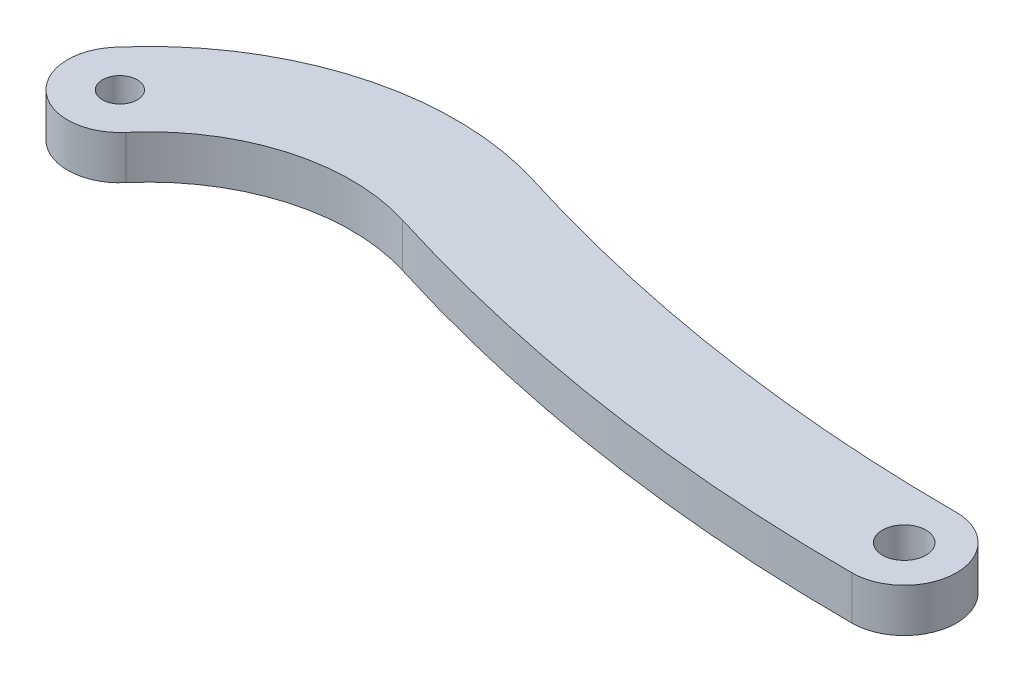
ISO-10303-21;
HEADER;
FILE_DESCRIPTION(('STEP AP214'),'2;1');
FILE_NAME('part.step','',(''),(''),'','','');
FILE_SCHEMA(('AUTOMOTIVE_DESIGN { 1 0 10303 214 1 1 1 1 }'));
ENDSEC;
DATA;
#1=APPLICATION_CONTEXT('core data for automotive mechanical design processes');
#2=APPLICATION_PROTOCOL_DEFINITION('international standard','automotive_design',2000,#1);
#3=PRODUCT_CONTEXT('',#1,'mechanical');
#4=PRODUCT('Part','Part','',(#3));
#5=PRODUCT_RELATED_PRODUCT_CATEGORY('part','',(#4));
#6=PRODUCT_DEFINITION_FORMATION('','',#4);
#7=PRODUCT_DEFINITION_CONTEXT('part definition',#1,'design');
#8=PRODUCT_DEFINITION('design','',#6,#7);
#9=PRODUCT_DEFINITION_SHAPE('','',#8);
#10=(LENGTH_UNIT() NAMED_UNIT(*) SI_UNIT(.MILLI.,.METRE.));
#11=(NAMED_UNIT(*) PLANE_ANGLE_UNIT() SI_UNIT($,.RADIAN.));
#12=(NAMED_UNIT(*) SI_UNIT($,.STERADIAN.) SOLID_ANGLE_UNIT());
#13=UNCERTAINTY_MEASURE_WITH_UNIT(LENGTH_MEASURE(1.E-05),#10,'distance_accuracy_value','');
#14=(GEOMETRIC_REPRESENTATION_CONTEXT(3) GLOBAL_UNCERTAINTY_ASSIGNED_CONTEXT((#13)) GLOBAL_UNIT_ASSIGNED_CONTEXT((#10,
#11,#12)) REPRESENTATION_CONTEXT('',''));
#15=CARTESIAN_POINT('',(0.,0.,0.));
#16=DIRECTION('',(0.,0.,1.));
#17=DIRECTION('',(1.,0.,0.));
#18=AXIS2_PLACEMENT_3D('',#15,#16,#17);
#19=CARTESIAN_POINT('',(71.2982482615913,6.35,-113.88683676619));
#20=DIRECTION('',(0.,-1.,0.));
#21=DIRECTION('',(0.,0.,-1.));
#22=AXIS2_PLACEMENT_3D('',#19,#20,#21);
#23=PLANE('',#22);
#24=CARTESIAN_POINT('',(28.2964965231826,6.35,24.016302613433));
#25=DIRECTION('',(0.,-1.,0.));
#26=DIRECTION('',(0.,0.,-1.));
#27=AXIS2_PLACEMENT_3D('',#24,#25,#26);
#28=CIRCLE('',#27,29.4943436787784);
#29=CARTESIAN_POINT('',(5.80959494724787,6.35,4.93082209666016));
#30=VERTEX_POINT('',#29);
#31=CARTESIAN_POINT('',(37.0766244584948,6.35,-4.14085744367229));
#32=VERTEX_POINT('',#31);
#33=EDGE_CURVE('E146',#30,#32,#28,.T.);
#34=ORIENTED_EDGE('',*,*,#33,.T.);
#35=CARTESIAN_POINT('',(114.3,6.35,-251.789976145814));
#36=DIRECTION('',(0.,1.,0.));
#37=DIRECTION('',(0.,0.,1.));
#38=AXIS2_PLACEMENT_3D('',#35,#36,#37);
#39=CIRCLE('',#38,259.409976145814);
#40=CARTESIAN_POINT('',(114.3,6.35,7.62));
#41=VERTEX_POINT('',#40);
#42=EDGE_CURVE('E94',#32,#41,#39,.T.);
#43=ORIENTED_EDGE('',*,*,#42,.T.);
#44=CARTESIAN_POINT('',(114.3,6.35,0.));
#45=DIRECTION('',(0.,1.,0.));
#46=DIRECTION('',(0.,0.,1.));
#47=AXIS2_PLACEMENT_3D('',#44,#45,#46);
#48=CIRCLE('',#47,7.62);
#49=CARTESIAN_POINT('',(114.3,6.35,-7.61999999999993));
#50=VERTEX_POINT('',#49);
#51=EDGE_CURVE('E107',#41,#50,#48,.T.);
#52=ORIENTED_EDGE('',*,*,#51,.T.);
#53=CARTESIAN_POINT('',(114.3,6.35,-251.789976145814));
#54=DIRECTION('',(0.,-1.,0.));
#55=DIRECTION('',(0.,0.,-1.));
#56=AXIS2_PLACEMENT_3D('',#53,#54,#55);
#57=CIRCLE('',#56,244.169976145814);
#58=CARTESIAN_POINT('',(41.6133977188686,6.35,-18.6899223065408));
#59=VERTEX_POINT('',#58);
#60=EDGE_CURVE('E101',#50,#59,#57,.T.);
#61=ORIENTED_EDGE('',*,*,#60,.T.);
#62=CARTESIAN_POINT('',(28.2964965231826,6.35,24.016302613433));
#63=DIRECTION('',(0.,1.,0.));
#64=DIRECTION('',(0.,0.,-1.));
#65=AXIS2_PLACEMENT_3D('',#62,#63,#64);
#66=CIRCLE('',#65,44.7343436787784);
#67=CARTESIAN_POINT('',(-5.80959494724787,6.35,-4.93082209666016));
#68=VERTEX_POINT('',#67);
#69=EDGE_CURVE('E105',#59,#68,#66,.T.);
#70=ORIENTED_EDGE('',*,*,#69,.T.);
#71=CARTESIAN_POINT('',(0.,6.35,0.));
#72=DIRECTION('',(0.,1.,0.));
#73=DIRECTION('',(0.,0.,-1.));
#74=AXIS2_PLACEMENT_3D('',#71,#72,#73);
#75=CIRCLE('',#74,7.62);
#76=EDGE_CURVE('E57',#68,#30,#75,.T.);
#77=ORIENTED_EDGE('',*,*,#76,.T.);
#78=EDGE_LOOP('',(#34,#43,#52,#61,#70,#77));
#79=FACE_BOUND('',#78,.T.);
#80=CARTESIAN_POINT('',(0.,6.35,0.));
#81=DIRECTION('',(0.,1.,0.));
#82=DIRECTION('',(0.,0.,1.));
#83=AXIS2_PLACEMENT_3D('',#80,#81,#82);
#84=CIRCLE('',#83,2.54);
#85=CARTESIAN_POINT('',(0.,6.35,2.54));
#86=VERTEX_POINT('',#85);
#87=EDGE_CURVE('E134',#86,#86,#84,.T.);
#88=ORIENTED_EDGE('',*,*,#87,.F.);
#89=EDGE_LOOP('',(#88));
#90=FACE_BOUND('',#89,.T.);
#91=CARTESIAN_POINT('',(114.3,6.35,0.));
#92=DIRECTION('',(0.,1.,0.));
#93=DIRECTION('',(0.,0.,1.));
#94=AXIS2_PLACEMENT_3D('',#91,#92,#93);
#95=CIRCLE('',#94,3.175);
#96=CARTESIAN_POINT('',(114.3,6.35,3.175));
#97=VERTEX_POINT('',#96);
#98=EDGE_CURVE('E191',#97,#97,#95,.T.);
#99=ORIENTED_EDGE('',*,*,#98,.F.);
#100=EDGE_LOOP('',(#99));
#101=FACE_BOUND('',#100,.T.);
#102=ADVANCED_FACE('F39',(#79,#90,#101),#23,.F.);
#103=CARTESIAN_POINT('',(71.2982482615913,0.,-113.88683676619));
#104=DIRECTION('',(0.,-1.,0.));
#105=DIRECTION('',(0.,0.,-1.));
#106=AXIS2_PLACEMENT_3D('',#103,#104,#105);
#107=PLANE('',#106);
#108=CARTESIAN_POINT('',(0.,0.,0.));
#109=DIRECTION('',(0.,1.,0.));
#110=DIRECTION('',(0.,0.,1.));
#111=AXIS2_PLACEMENT_3D('',#108,#109,#110);
#112=CIRCLE('',#111,2.54);
#113=CARTESIAN_POINT('',(0.,0.,2.54));
#114=VERTEX_POINT('',#113);
#115=EDGE_CURVE('E198',#114,#114,#112,.T.);
#116=ORIENTED_EDGE('',*,*,#115,.T.);
#117=EDGE_LOOP('',(#116));
#118=FACE_BOUND('',#117,.T.);
#119=CARTESIAN_POINT('',(28.2964965231826,0.,24.016302613433));
#120=DIRECTION('',(0.,-1.,0.));
#121=DIRECTION('',(0.,0.,-1.));
#122=AXIS2_PLACEMENT_3D('',#119,#120,#121);
#123=CIRCLE('',#122,29.4943436787784);
#124=CARTESIAN_POINT('',(5.80959494724787,0.,4.93082209666016));
#125=VERTEX_POINT('',#124);
#126=CARTESIAN_POINT('',(37.0766244584948,0.,-4.14085744367229));
#127=VERTEX_POINT('',#126);
#128=EDGE_CURVE('E129',#125,#127,#123,.T.);
#129=ORIENTED_EDGE('',*,*,#128,.F.);
#130=CARTESIAN_POINT('',(0.,0.,0.));
#131=DIRECTION('',(0.,1.,0.));
#132=DIRECTION('',(0.,0.,-1.));
#133=AXIS2_PLACEMENT_3D('',#130,#131,#132);
#134=CIRCLE('',#133,7.62);
#135=CARTESIAN_POINT('',(-5.80959494724787,0.,-4.93082209666016));
#136=VERTEX_POINT('',#135);
#137=EDGE_CURVE('E86',#136,#125,#134,.T.);
#138=ORIENTED_EDGE('',*,*,#137,.F.);
#139=CARTESIAN_POINT('',(28.2964965231826,0.,24.016302613433));
#140=DIRECTION('',(0.,1.,0.));
#141=DIRECTION('',(0.,0.,-1.));
#142=AXIS2_PLACEMENT_3D('',#139,#140,#141);
#143=CIRCLE('',#142,44.7343436787784);
#144=CARTESIAN_POINT('',(41.6133977188686,0.,-18.6899223065408));
#145=VERTEX_POINT('',#144);
#146=EDGE_CURVE('E80',#145,#136,#143,.T.);
#147=ORIENTED_EDGE('',*,*,#146,.F.);
#148=CARTESIAN_POINT('',(114.3,0.,-251.789976145814));
#149=DIRECTION('',(0.,-1.,0.));
#150=DIRECTION('',(0.,0.,-1.));
#151=AXIS2_PLACEMENT_3D('',#148,#149,#150);
#152=CIRCLE('',#151,244.169976145814);
#153=CARTESIAN_POINT('',(114.3,0.,-7.61999999999993));
#154=VERTEX_POINT('',#153);
#155=EDGE_CURVE('E116',#154,#145,#152,.T.);
#156=ORIENTED_EDGE('',*,*,#155,.F.);
#157=CARTESIAN_POINT('',(114.3,0.,0.));
#158=DIRECTION('',(0.,1.,0.));
#159=DIRECTION('',(0.,0.,1.));
#160=AXIS2_PLACEMENT_3D('',#157,#158,#159);
#161=CIRCLE('',#160,7.62);
#162=CARTESIAN_POINT('',(114.3,0.,7.62));
#163=VERTEX_POINT('',#162);
#164=EDGE_CURVE('E137',#163,#154,#161,.T.);
#165=ORIENTED_EDGE('',*,*,#164,.F.);
#166=CARTESIAN_POINT('',(114.3,0.,-251.789976145814));
#167=DIRECTION('',(0.,1.,0.));
#168=DIRECTION('',(0.,0.,1.));
#169=AXIS2_PLACEMENT_3D('',#166,#167,#168);
#170=CIRCLE('',#169,259.409976145814);
#171=EDGE_CURVE('E133',#127,#163,#170,.T.);
#172=ORIENTED_EDGE('',*,*,#171,.F.);
#173=EDGE_LOOP('',(#129,#138,#147,#156,#165,#172));
#174=FACE_BOUND('',#173,.T.);
#175=CARTESIAN_POINT('',(114.3,0.,0.));
#176=DIRECTION('',(0.,1.,0.));
#177=DIRECTION('',(0.,0.,1.));
#178=AXIS2_PLACEMENT_3D('',#175,#176,#177);
#179=CIRCLE('',#178,3.175);
#180=CARTESIAN_POINT('',(114.3,0.,3.175));
#181=VERTEX_POINT('',#180);
#182=EDGE_CURVE('E194',#181,#181,#179,.T.);
#183=ORIENTED_EDGE('',*,*,#182,.T.);
#184=EDGE_LOOP('',(#183));
#185=FACE_BOUND('',#184,.T.);
#186=ADVANCED_FACE('F159',(#118,#174,#185),#107,.T.);
#187=CARTESIAN_POINT('',(28.2964965231826,6.35,24.016302613433));
#188=DIRECTION('',(0.,-1.,0.));
#189=DIRECTION('',(0.,0.,-1.));
#190=AXIS2_PLACEMENT_3D('',#187,#188,#189);
#191=CYLINDRICAL_SURFACE('',#190,29.4943436787784);
#192=ORIENTED_EDGE('',*,*,#128,.T.);
#193=DIRECTION('',(0.,-1.,0.));
#194=VECTOR('',#193,1.);
#195=CARTESIAN_POINT('',(37.0766244584948,6.35,-4.14085744367229));
#196=LINE('',#195,#194);
#197=EDGE_CURVE('E11',#32,#127,#196,.T.);
#198=ORIENTED_EDGE('',*,*,#197,.F.);
#199=ORIENTED_EDGE('',*,*,#33,.F.);
#200=DIRECTION('',(0.,-1.,0.));
#201=VECTOR('',#200,1.);
#202=CARTESIAN_POINT('',(5.80959494724787,6.35,4.93082209666016));
#203=LINE('',#202,#201);
#204=EDGE_CURVE('E125',#30,#125,#203,.T.);
#205=ORIENTED_EDGE('',*,*,#204,.T.);
#206=EDGE_LOOP('',(#192,#198,#199,#205));
#207=FACE_BOUND('',#206,.T.);
#208=ADVANCED_FACE('F41',(#207),#191,.F.);
#209=CARTESIAN_POINT('',(114.3,6.35,-251.789976145814));
#210=DIRECTION('',(0.,-1.,0.));
#211=DIRECTION('',(0.,0.,-1.));
#212=AXIS2_PLACEMENT_3D('',#209,#210,#211);
#213=CYLINDRICAL_SURFACE('',#212,259.409976145814);
#214=ORIENTED_EDGE('',*,*,#171,.T.);
#215=DIRECTION('',(0.,-1.,0.));
#216=VECTOR('',#215,1.);
#217=CARTESIAN_POINT('',(114.3,6.35,7.62));
#218=LINE('',#217,#216);
#219=EDGE_CURVE('E49',#41,#163,#218,.T.);
#220=ORIENTED_EDGE('',*,*,#219,.F.);
#221=ORIENTED_EDGE('',*,*,#42,.F.);
#222=ORIENTED_EDGE('',*,*,#197,.T.);
#223=EDGE_LOOP('',(#214,#220,#221,#222));
#224=FACE_BOUND('',#223,.T.);
#225=ADVANCED_FACE('F246',(#224),#213,.T.);
#226=CARTESIAN_POINT('',(114.3,6.35,0.));
#227=DIRECTION('',(0.,-1.,0.));
#228=DIRECTION('',(0.,0.,-1.));
#229=AXIS2_PLACEMENT_3D('',#226,#227,#228);
#230=CYLINDRICAL_SURFACE('',#229,7.62);
#231=ORIENTED_EDGE('',*,*,#164,.T.);
#232=DIRECTION('',(0.,-1.,0.));
#233=VECTOR('',#232,1.);
#234=CARTESIAN_POINT('',(114.3,6.35,-7.61999999999993));
#235=LINE('',#234,#233);
#236=EDGE_CURVE('E118',#50,#154,#235,.T.);
#237=ORIENTED_EDGE('',*,*,#236,.F.);
#238=ORIENTED_EDGE('',*,*,#51,.F.);
#239=ORIENTED_EDGE('',*,*,#219,.T.);
#240=EDGE_LOOP('',(#231,#237,#238,#239));
#241=FACE_BOUND('',#240,.T.);
#242=ADVANCED_FACE('F156',(#241),#230,.T.);
#243=CARTESIAN_POINT('',(114.3,6.35,-251.789976145814));
#244=DIRECTION('',(0.,-1.,0.));
#245=DIRECTION('',(0.,0.,-1.));
#246=AXIS2_PLACEMENT_3D('',#243,#244,#245);
#247=CYLINDRICAL_SURFACE('',#246,244.169976145814);
#248=ORIENTED_EDGE('',*,*,#155,.T.);
#249=DIRECTION('',(0.,-1.,0.));
#250=VECTOR('',#249,1.);
#251=CARTESIAN_POINT('',(41.6133977188686,6.35,-18.6899223065408));
#252=LINE('',#251,#250);
#253=EDGE_CURVE('E113',#59,#145,#252,.T.);
#254=ORIENTED_EDGE('',*,*,#253,.F.);
#255=ORIENTED_EDGE('',*,*,#60,.F.);
#256=ORIENTED_EDGE('',*,*,#236,.T.);
#257=EDGE_LOOP('',(#248,#254,#255,#256));
#258=FACE_BOUND('',#257,.T.);
#259=ADVANCED_FACE('F114',(#258),#247,.F.);
#260=CARTESIAN_POINT('',(28.2964965231826,6.35,24.016302613433));
#261=DIRECTION('',(0.,-1.,0.));
#262=DIRECTION('',(0.,0.,-1.));
#263=AXIS2_PLACEMENT_3D('',#260,#261,#262);
#264=CYLINDRICAL_SURFACE('',#263,44.7343436787784);
#265=ORIENTED_EDGE('',*,*,#146,.T.);
#266=DIRECTION('',(0.,-1.,0.));
#267=VECTOR('',#266,1.);
#268=CARTESIAN_POINT('',(-5.80959494724787,6.35,-4.93082209666016));
#269=LINE('',#268,#267);
#270=EDGE_CURVE('E119',#68,#136,#269,.T.);
#271=ORIENTED_EDGE('',*,*,#270,.F.);
#272=ORIENTED_EDGE('',*,*,#69,.F.);
#273=ORIENTED_EDGE('',*,*,#253,.T.);
#274=EDGE_LOOP('',(#265,#271,#272,#273));
#275=FACE_BOUND('',#274,.T.);
#276=ADVANCED_FACE('F121',(#275),#264,.T.);
#277=CARTESIAN_POINT('',(0.,6.35,0.));
#278=DIRECTION('',(0.,-1.,0.));
#279=DIRECTION('',(0.,0.,-1.));
#280=AXIS2_PLACEMENT_3D('',#277,#278,#279);
#281=CYLINDRICAL_SURFACE('',#280,7.62);
#282=ORIENTED_EDGE('',*,*,#137,.T.);
#283=ORIENTED_EDGE('',*,*,#204,.F.);
#284=ORIENTED_EDGE('',*,*,#76,.F.);
#285=ORIENTED_EDGE('',*,*,#270,.T.);
#286=EDGE_LOOP('',(#282,#283,#284,#285));
#287=FACE_BOUND('',#286,.T.);
#288=ADVANCED_FACE('F164',(#287),#281,.T.);
#289=CARTESIAN_POINT('',(0.,6.35,0.));
#290=DIRECTION('',(0.,-1.,0.));
#291=DIRECTION('',(0.,0.,-1.));
#292=AXIS2_PLACEMENT_3D('',#289,#290,#291);
#293=CYLINDRICAL_SURFACE('',#292,2.54);
#294=ORIENTED_EDGE('',*,*,#87,.T.);
#295=EDGE_LOOP('',(#294));
#296=FACE_BOUND('',#295,.T.);
#297=ORIENTED_EDGE('',*,*,#115,.F.);
#298=EDGE_LOOP('',(#297));
#299=FACE_BOUND('',#298,.T.);
#300=ADVANCED_FACE('F166',(#296,#299),#293,.F.);
#301=CARTESIAN_POINT('',(114.3,6.35,0.));
#302=DIRECTION('',(0.,-1.,0.));
#303=DIRECTION('',(0.,0.,-1.));
#304=AXIS2_PLACEMENT_3D('',#301,#302,#303);
#305=CYLINDRICAL_SURFACE('',#304,3.175);
#306=ORIENTED_EDGE('',*,*,#98,.T.);
#307=EDGE_LOOP('',(#306));
#308=FACE_BOUND('',#307,.T.);
#309=ORIENTED_EDGE('',*,*,#182,.F.);
#310=EDGE_LOOP('',(#309));
#311=FACE_BOUND('',#310,.T.);
#312=ADVANCED_FACE('F172',(#308,#311),#305,.F.);
#313=CLOSED_SHELL('',(#102,#186,#208,#225,#242,#259,#276,#288,#300,#312));
#314=MANIFOLD_SOLID_BREP('B2',#313);
#315=ADVANCED_BREP_SHAPE_REPRESENTATION('',(#18,#314),#14);
#316=SHAPE_DEFINITION_REPRESENTATION(#9,#315);
ENDSEC;
END-ISO-10303-21;
